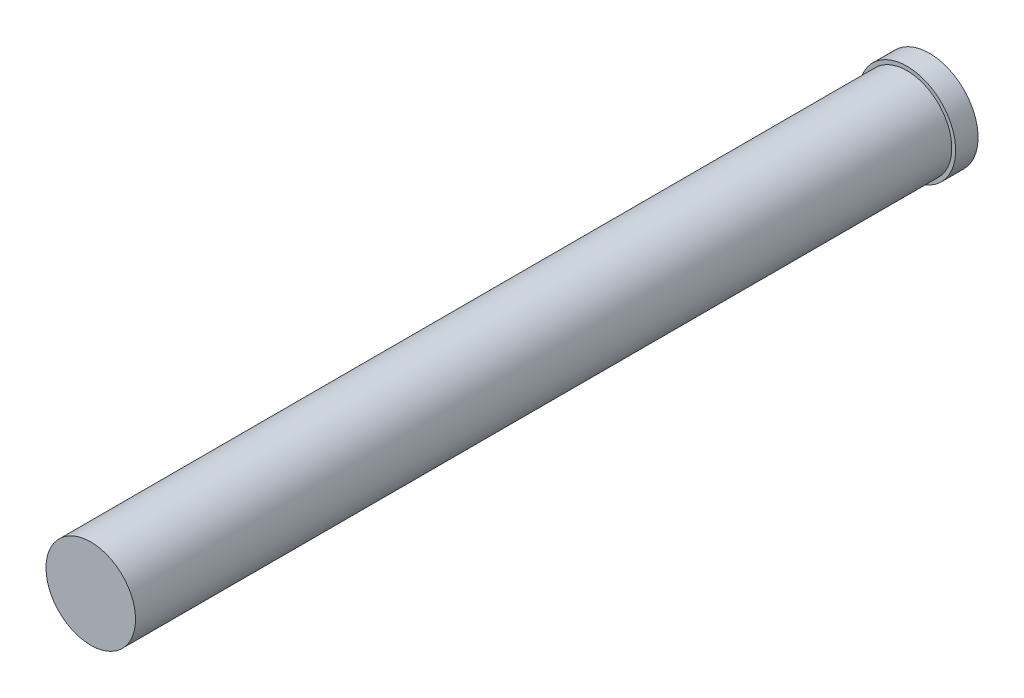
ISO-10303-21;
HEADER;
FILE_DESCRIPTION(('STEP AP214'),'2;1');
FILE_NAME('part.step','',(''),(''),'','','');
FILE_SCHEMA(('AUTOMOTIVE_DESIGN { 1 0 10303 214 1 1 1 1 }'));
ENDSEC;
DATA;
#1=APPLICATION_CONTEXT('core data for automotive mechanical design processes');
#2=APPLICATION_PROTOCOL_DEFINITION('international standard','automotive_design',2000,#1);
#3=PRODUCT_CONTEXT('',#1,'mechanical');
#4=PRODUCT('Part','Part','',(#3));
#5=PRODUCT_RELATED_PRODUCT_CATEGORY('part','',(#4));
#6=PRODUCT_DEFINITION_FORMATION('','',#4);
#7=PRODUCT_DEFINITION_CONTEXT('part definition',#1,'design');
#8=PRODUCT_DEFINITION('design','',#6,#7);
#9=PRODUCT_DEFINITION_SHAPE('','',#8);
#10=(LENGTH_UNIT() NAMED_UNIT(*) SI_UNIT(.MILLI.,.METRE.));
#11=(NAMED_UNIT(*) PLANE_ANGLE_UNIT() SI_UNIT($,.RADIAN.));
#12=(NAMED_UNIT(*) SI_UNIT($,.STERADIAN.) SOLID_ANGLE_UNIT());
#13=UNCERTAINTY_MEASURE_WITH_UNIT(LENGTH_MEASURE(1.E-05),#10,'distance_accuracy_value','');
#14=(GEOMETRIC_REPRESENTATION_CONTEXT(3) GLOBAL_UNCERTAINTY_ASSIGNED_CONTEXT((#13)) GLOBAL_UNIT_ASSIGNED_CONTEXT((#10,
#11,#12)) REPRESENTATION_CONTEXT('',''));
#15=CARTESIAN_POINT('',(0.,0.,0.));
#16=DIRECTION('',(0.,0.,1.));
#17=DIRECTION('',(1.,0.,0.));
#18=AXIS2_PLACEMENT_3D('',#15,#16,#17);
#19=CARTESIAN_POINT('',(0.,0.,356.));
#20=DIRECTION('',(0.,0.,-1.));
#21=DIRECTION('',(-1.,0.,0.));
#22=AXIS2_PLACEMENT_3D('',#19,#20,#21);
#23=CYLINDRICAL_SURFACE('',#22,19.);
#24=CARTESIAN_POINT('',(0.,0.,356.));
#25=DIRECTION('',(0.,0.,1.));
#26=DIRECTION('',(1.,0.,0.));
#27=AXIS2_PLACEMENT_3D('',#24,#25,#26);
#28=CIRCLE('',#27,19.);
#29=CARTESIAN_POINT('',(19.,0.,356.));
#30=VERTEX_POINT('',#29);
#31=EDGE_CURVE('E43',#30,#30,#28,.T.);
#32=ORIENTED_EDGE('',*,*,#31,.F.);
#33=EDGE_LOOP('',(#32));
#34=FACE_BOUND('',#33,.T.);
#35=CARTESIAN_POINT('',(0.,0.,9.52500000000001));
#36=DIRECTION('',(0.,0.,-1.));
#37=DIRECTION('',(-1.,0.,0.));
#38=AXIS2_PLACEMENT_3D('',#35,#36,#37);
#39=CIRCLE('',#38,19.);
#40=CARTESIAN_POINT('',(-19.,0.,9.52500000000001));
#41=VERTEX_POINT('',#40);
#42=EDGE_CURVE('E10',#41,#41,#39,.T.);
#43=ORIENTED_EDGE('',*,*,#42,.F.);
#44=EDGE_LOOP('',(#43));
#45=FACE_BOUND('',#44,.T.);
#46=ADVANCED_FACE('F40',(#34,#45),#23,.T.);
#47=CARTESIAN_POINT('',(0.,0.,356.));
#48=DIRECTION('',(0.,0.,1.));
#49=DIRECTION('',(1.,0.,0.));
#50=AXIS2_PLACEMENT_3D('',#47,#48,#49);
#51=PLANE('',#50);
#52=ORIENTED_EDGE('',*,*,#31,.T.);
#53=EDGE_LOOP('',(#52));
#54=FACE_BOUND('',#53,.T.);
#55=ADVANCED_FACE('F76',(#54),#51,.T.);
#56=CARTESIAN_POINT('',(0.,0.,9.525));
#57=DIRECTION('',(0.,0.,-1.));
#58=DIRECTION('',(-1.,0.,0.));
#59=AXIS2_PLACEMENT_3D('',#56,#57,#58);
#60=CYLINDRICAL_SURFACE('',#59,20.6375);
#61=CARTESIAN_POINT('',(0.,0.,9.525));
#62=DIRECTION('',(0.,0.,-1.));
#63=DIRECTION('',(-1.,0.,0.));
#64=AXIS2_PLACEMENT_3D('',#61,#62,#63);
#65=CIRCLE('',#64,20.6375);
#66=CARTESIAN_POINT('',(-20.6375,0.,9.525));
#67=VERTEX_POINT('',#66);
#68=EDGE_CURVE('E50',#67,#67,#65,.T.);
#69=CARTESIAN_POINT('',(0.,0.,0.));
#70=DIRECTION('',(0.,0.,-1.));
#71=DIRECTION('',(-1.,0.,0.));
#72=AXIS2_PLACEMENT_3D('',#69,#70,#71);
#73=CIRCLE('',#72,20.6375);
#74=CARTESIAN_POINT('',(-20.6375,0.,0.));
#75=VERTEX_POINT('',#74);
#76=EDGE_CURVE('E51',#75,#75,#73,.T.);
#77=CARTESIAN_POINT('',(-20.6375,0.,9.525));
#78=CARTESIAN_POINT('',(-20.6375,0.,9.42578125));
#79=CARTESIAN_POINT('',(-20.6375,0.,9.3265625));
#80=CARTESIAN_POINT('',(-20.6375,0.,9.128125));
#81=CARTESIAN_POINT('',(-20.6375,0.,9.02890625));
#82=CARTESIAN_POINT('',(-20.6375,0.,8.83046875));
#83=CARTESIAN_POINT('',(-20.6375,0.,8.73125));
#84=CARTESIAN_POINT('',(-20.6375,0.,8.5328125));
#85=CARTESIAN_POINT('',(-20.6375,0.,8.43359375));
#86=CARTESIAN_POINT('',(-20.6375,0.,8.23515625));
#87=CARTESIAN_POINT('',(-20.6375,0.,8.1359375));
#88=CARTESIAN_POINT('',(-20.6375,0.,7.9375));
#89=CARTESIAN_POINT('',(-20.6375,0.,7.83828125));
#90=CARTESIAN_POINT('',(-20.6375,0.,7.63984375));
#91=CARTESIAN_POINT('',(-20.6375,0.,7.540625));
#92=CARTESIAN_POINT('',(-20.6375,0.,7.3421875));
#93=CARTESIAN_POINT('',(-20.6375,0.,7.24296875));
#94=CARTESIAN_POINT('',(-20.6375,0.,7.04453125));
#95=CARTESIAN_POINT('',(-20.6375,0.,6.9453125));
#96=CARTESIAN_POINT('',(-20.6375,0.,6.746875));
#97=CARTESIAN_POINT('',(-20.6375,0.,6.64765625));
#98=CARTESIAN_POINT('',(-20.6375,0.,6.44921875));
#99=CARTESIAN_POINT('',(-20.6375,0.,6.35));
#100=CARTESIAN_POINT('',(-20.6375,0.,6.1515625));
#101=CARTESIAN_POINT('',(-20.6375,0.,6.05234375));
#102=CARTESIAN_POINT('',(-20.6375,0.,5.85390625));
#103=CARTESIAN_POINT('',(-20.6375,0.,5.7546875));
#104=CARTESIAN_POINT('',(-20.6375,0.,5.55625));
#105=CARTESIAN_POINT('',(-20.6375,0.,5.45703125));
#106=CARTESIAN_POINT('',(-20.6375,0.,5.25859375));
#107=CARTESIAN_POINT('',(-20.6375,0.,5.159375));
#108=CARTESIAN_POINT('',(-20.6375,0.,4.9609375));
#109=CARTESIAN_POINT('',(-20.6375,0.,4.86171875));
#110=CARTESIAN_POINT('',(-20.6375,0.,4.66328125));
#111=CARTESIAN_POINT('',(-20.6375,0.,4.5640625));
#112=CARTESIAN_POINT('',(-20.6375,0.,4.365625));
#113=CARTESIAN_POINT('',(-20.6375,0.,4.26640625));
#114=CARTESIAN_POINT('',(-20.6375,0.,4.06796875));
#115=CARTESIAN_POINT('',(-20.6375,0.,3.96875));
#116=CARTESIAN_POINT('',(-20.6375,0.,3.7703125));
#117=CARTESIAN_POINT('',(-20.6375,0.,3.67109375));
#118=CARTESIAN_POINT('',(-20.6375,0.,3.47265625));
#119=CARTESIAN_POINT('',(-20.6375,0.,3.3734375));
#120=CARTESIAN_POINT('',(-20.6375,0.,3.175));
#121=CARTESIAN_POINT('',(-20.6375,0.,3.07578125));
#122=CARTESIAN_POINT('',(-20.6375,0.,2.87734375));
#123=CARTESIAN_POINT('',(-20.6375,0.,2.778125));
#124=CARTESIAN_POINT('',(-20.6375,0.,2.5796875));
#125=CARTESIAN_POINT('',(-20.6375,0.,2.48046875));
#126=CARTESIAN_POINT('',(-20.6375,0.,2.28203125));
#127=CARTESIAN_POINT('',(-20.6375,0.,2.1828125));
#128=CARTESIAN_POINT('',(-20.6375,0.,1.984375));
#129=CARTESIAN_POINT('',(-20.6375,0.,1.88515625));
#130=CARTESIAN_POINT('',(-20.6375,0.,1.68671875));
#131=CARTESIAN_POINT('',(-20.6375,0.,1.5875));
#132=CARTESIAN_POINT('',(-20.6375,0.,1.3890625));
#133=CARTESIAN_POINT('',(-20.6375,0.,1.28984375));
#134=CARTESIAN_POINT('',(-20.6375,0.,1.09140625));
#135=CARTESIAN_POINT('',(-20.6375,0.,0.992187500000001));
#136=CARTESIAN_POINT('',(-20.6375,0.,0.793750000000001));
#137=CARTESIAN_POINT('',(-20.6375,0.,0.69453125));
#138=CARTESIAN_POINT('',(-20.6375,0.,0.49609375));
#139=CARTESIAN_POINT('',(-20.6375,0.,0.396875));
#140=CARTESIAN_POINT('',(-20.6375,0.,0.1984375));
#141=CARTESIAN_POINT('',(-20.6375,0.,0.0992187500000001));
#142=CARTESIAN_POINT('',(-20.6375,0.,0.));
#143=B_SPLINE_CURVE_WITH_KNOTS('',3,(#77,#78,#79,#80,#81,#82,#83,#84,#85,#86,#87,#88,#89,#90,
#91,#92,#93,#94,#95,#96,#97,#98,#99,#100,#101,#102,#103,#104,#105,#106,#107,#108,#109,#110,#111,
#112,#113,#114,#115,#116,#117,#118,#119,#120,#121,#122,#123,#124,#125,#126,#127,#128,#129,#130,
#131,#132,#133,#134,#135,#136,#137,#138,#139,#140,#141,#142),.UNSPECIFIED.,.F.,.F.,(4,2,2,2,2,2,
2,2,2,2,2,2,2,2,2,2,2,2,2,2,2,2,2,2,2,2,2,2,2,2,2,2,4),(0.,0.297656249999998,0.595312499999999,
0.892968749999999,1.190625,1.48828125,1.7859375,2.08359375,2.38125,2.67890625,2.9765625,
3.27421875,3.571875,3.86953125,4.1671875,4.46484375,4.7625,5.06015625,5.3578125,5.65546875,
5.953125,6.25078125,6.5484375,6.84609375,7.14375,7.44140625,7.7390625,8.03671875,8.334375,
8.63203125,8.9296875,9.22734375,9.525),.UNSPECIFIED.);
#144=EDGE_CURVE('BSEAM79',#67,#75,#143,.T.);
#145=ORIENTED_EDGE('',*,*,#68,.T.);
#146=ORIENTED_EDGE('',*,*,#76,.F.);
#147=ORIENTED_EDGE('',*,*,#144,.T.);
#148=ORIENTED_EDGE('',*,*,#144,.F.);
#149=EDGE_LOOP('',(#145,#147,#146,#148));
#150=FACE_BOUND('',#149,.T.);
#151=ADVANCED_FACE('F79',(#150),#60,.T.);
#152=CARTESIAN_POINT('',(0.,0.,9.525));
#153=DIRECTION('',(0.,0.,-1.));
#154=DIRECTION('',(-1.,0.,0.));
#155=AXIS2_PLACEMENT_3D('',#152,#153,#154);
#156=PLANE('',#155);
#157=ORIENTED_EDGE('',*,*,#42,.T.);
#158=EDGE_LOOP('',(#157));
#159=FACE_BOUND('',#158,.T.);
#160=ORIENTED_EDGE('',*,*,#68,.F.);
#161=EDGE_LOOP('',(#160));
#162=FACE_BOUND('',#161,.T.);
#163=ADVANCED_FACE('F74',(#159,#162),#156,.F.);
#164=CARTESIAN_POINT('',(0.,0.,0.));
#165=DIRECTION('',(0.,0.,1.));
#166=DIRECTION('',(1.,0.,0.));
#167=AXIS2_PLACEMENT_3D('',#164,#165,#166);
#168=PLANE('',#167);
#169=CARTESIAN_POINT('',(0.,0.,0.));
#170=DIRECTION('',(0.,0.,-1.));
#171=DIRECTION('',(-1.,0.,0.));
#172=AXIS2_PLACEMENT_3D('',#169,#170,#171);
#173=CIRCLE('',#172,15.);
#174=CARTESIAN_POINT('',(-15.,0.,0.));
#175=VERTEX_POINT('',#174);
#176=EDGE_CURVE('E60',#175,#175,#173,.T.);
#177=ORIENTED_EDGE('',*,*,#176,.F.);
#178=EDGE_LOOP('',(#177));
#179=FACE_BOUND('',#178,.T.);
#180=ORIENTED_EDGE('',*,*,#76,.T.);
#181=EDGE_LOOP('',(#180));
#182=FACE_BOUND('',#181,.T.);
#183=ADVANCED_FACE('F67',(#179,#182),#168,.F.);
#184=CARTESIAN_POINT('',(0.,0.,300.));
#185=DIRECTION('',(0.,0.,-1.));
#186=DIRECTION('',(-1.,0.,0.));
#187=AXIS2_PLACEMENT_3D('',#184,#185,#186);
#188=CYLINDRICAL_SURFACE('',#187,15.);
#189=CARTESIAN_POINT('',(0.,0.,300.));
#190=DIRECTION('',(0.,0.,-1.));
#191=DIRECTION('',(-1.,0.,0.));
#192=AXIS2_PLACEMENT_3D('',#189,#190,#191);
#193=CIRCLE('',#192,15.);
#194=CARTESIAN_POINT('',(-15.,0.,300.));
#195=VERTEX_POINT('',#194);
#196=EDGE_CURVE('E54',#195,#195,#193,.T.);
#197=ORIENTED_EDGE('',*,*,#196,.F.);
#198=EDGE_LOOP('',(#197));
#199=FACE_BOUND('',#198,.T.);
#200=ORIENTED_EDGE('',*,*,#176,.T.);
#201=EDGE_LOOP('',(#200));
#202=FACE_BOUND('',#201,.T.);
#203=ADVANCED_FACE('F63',(#199,#202),#188,.F.);
#204=CARTESIAN_POINT('',(0.,0.,300.));
#205=DIRECTION('',(0.,0.,-1.));
#206=DIRECTION('',(-1.,0.,0.));
#207=AXIS2_PLACEMENT_3D('',#204,#205,#206);
#208=PLANE('',#207);
#209=ORIENTED_EDGE('',*,*,#196,.T.);
#210=EDGE_LOOP('',(#209));
#211=FACE_BOUND('',#210,.T.);
#212=ADVANCED_FACE('F65',(#211),#208,.T.);
#213=CLOSED_SHELL('',(#46,#55,#151,#163,#183,#203,#212));
#214=MANIFOLD_SOLID_BREP('B2',#213);
#215=ADVANCED_BREP_SHAPE_REPRESENTATION('',(#18,#214),#14);
#216=SHAPE_DEFINITION_REPRESENTATION(#9,#215);
ENDSEC;
END-ISO-10303-21;
